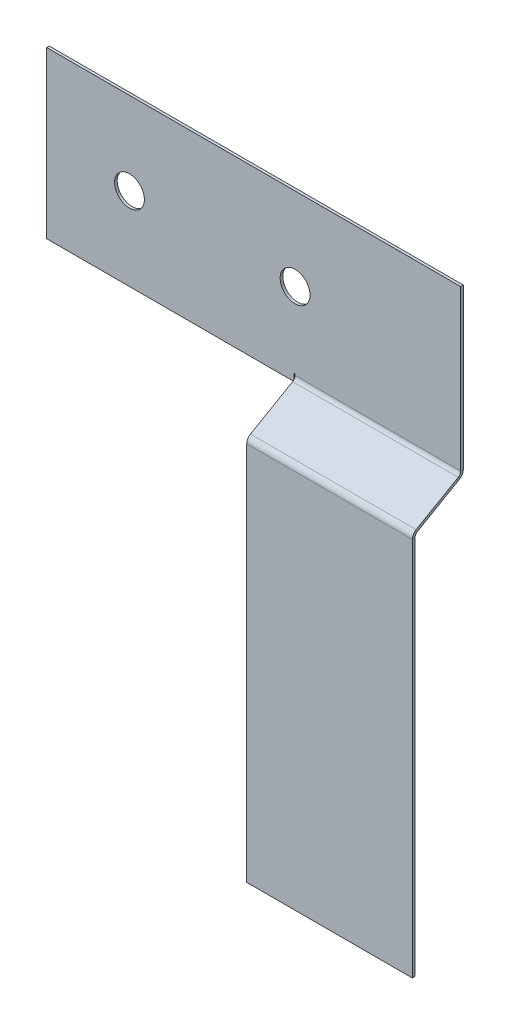
ISO-10303-21;
HEADER;
FILE_DESCRIPTION(('STEP AP214'),'2;1');
FILE_NAME('part.step','',(''),(''),'','','');
FILE_SCHEMA(('AUTOMOTIVE_DESIGN { 1 0 10303 214 1 1 1 1 }'));
ENDSEC;
DATA;
#1=APPLICATION_CONTEXT('core data for automotive mechanical design processes');
#2=APPLICATION_PROTOCOL_DEFINITION('international standard','automotive_design',2000,#1);
#3=PRODUCT_CONTEXT('',#1,'mechanical');
#4=PRODUCT('Part','Part','',(#3));
#5=PRODUCT_RELATED_PRODUCT_CATEGORY('part','',(#4));
#6=PRODUCT_DEFINITION_FORMATION('','',#4);
#7=PRODUCT_DEFINITION_CONTEXT('part definition',#1,'design');
#8=PRODUCT_DEFINITION('design','',#6,#7);
#9=PRODUCT_DEFINITION_SHAPE('','',#8);
#10=(LENGTH_UNIT() NAMED_UNIT(*) SI_UNIT(.MILLI.,.METRE.));
#11=(NAMED_UNIT(*) PLANE_ANGLE_UNIT() SI_UNIT($,.RADIAN.));
#12=(NAMED_UNIT(*) SI_UNIT($,.STERADIAN.) SOLID_ANGLE_UNIT());
#13=UNCERTAINTY_MEASURE_WITH_UNIT(LENGTH_MEASURE(1.E-05),#10,'distance_accuracy_value','');
#14=(GEOMETRIC_REPRESENTATION_CONTEXT(3) GLOBAL_UNCERTAINTY_ASSIGNED_CONTEXT((#13)) GLOBAL_UNIT_ASSIGNED_CONTEXT((#10,
#11,#12)) REPRESENTATION_CONTEXT('',''));
#15=CARTESIAN_POINT('',(0.,0.,0.));
#16=DIRECTION('',(0.,0.,1.));
#17=DIRECTION('',(1.,0.,0.));
#18=AXIS2_PLACEMENT_3D('',#15,#16,#17);
#19=CARTESIAN_POINT('',(62.5,0.,-0.4));
#20=DIRECTION('',(1.,0.,0.));
#21=DIRECTION('',(0.,0.,-1.));
#22=AXIS2_PLACEMENT_3D('',#19,#20,#21);
#23=PLANE('',#22);
#24=DIRECTION('',(0.,1.,0.));
#25=VECTOR('',#24,1.);
#26=CARTESIAN_POINT('',(62.5,0.,0.));
#27=LINE('',#26,#25);
#28=CARTESIAN_POINT('',(62.5,0.88715642363678,0.));
#29=VERTEX_POINT('',#28);
#30=CARTESIAN_POINT('',(62.5,25.,0.));
#31=VERTEX_POINT('',#30);
#32=EDGE_CURVE('E353',#29,#31,#27,.T.);
#33=ORIENTED_EDGE('',*,*,#32,.F.);
#34=DIRECTION('',(0.,0.,-1.));
#35=VECTOR('',#34,1.);
#36=CARTESIAN_POINT('',(62.5,0.88715642363678,0.));
#37=LINE('',#36,#35);
#38=CARTESIAN_POINT('',(62.5,0.88715642363678,-0.400000000000014));
#39=VERTEX_POINT('',#38);
#40=EDGE_CURVE('E287',#29,#39,#37,.T.);
#41=ORIENTED_EDGE('',*,*,#40,.T.);
#42=DIRECTION('',(0.,1.,0.));
#43=VECTOR('',#42,1.);
#44=CARTESIAN_POINT('',(62.5,0.,-0.4));
#45=LINE('',#44,#43);
#46=CARTESIAN_POINT('',(62.5,25.,-0.4));
#47=VERTEX_POINT('',#46);
#48=EDGE_CURVE('E344',#39,#47,#45,.T.);
#49=ORIENTED_EDGE('',*,*,#48,.T.);
#50=DIRECTION('',(0.,0.,1.));
#51=VECTOR('',#50,1.);
#52=CARTESIAN_POINT('',(62.5,25.,-0.4));
#53=LINE('',#52,#51);
#54=EDGE_CURVE('E86',#47,#31,#53,.T.);
#55=ORIENTED_EDGE('',*,*,#54,.T.);
#56=EDGE_LOOP('',(#33,#41,#49,#55));
#57=FACE_BOUND('',#56,.T.);
#58=ADVANCED_FACE('F77',(#57),#23,.T.);
#59=CARTESIAN_POINT('',(0.,0.,-0.4));
#60=DIRECTION('',(0.,-1.,0.));
#61=DIRECTION('',(0.,0.,-1.));
#62=AXIS2_PLACEMENT_3D('',#59,#60,#61);
#63=PLANE('',#62);
#64=DIRECTION('',(1.,0.,0.));
#65=VECTOR('',#64,1.);
#66=CARTESIAN_POINT('',(0.,0.,-0.4));
#67=LINE('',#66,#65);
#68=CARTESIAN_POINT('',(0.,0.,-0.4));
#69=VERTEX_POINT('',#68);
#70=CARTESIAN_POINT('',(37.3,0.,-0.4));
#71=VERTEX_POINT('',#70);
#72=EDGE_CURVE('E340',#69,#71,#67,.T.);
#73=ORIENTED_EDGE('',*,*,#72,.T.);
#74=DIRECTION('',(0.,0.,-1.));
#75=VECTOR('',#74,1.);
#76=CARTESIAN_POINT('',(37.3,0.,0.));
#77=LINE('',#76,#75);
#78=CARTESIAN_POINT('',(37.3,0.,0.));
#79=VERTEX_POINT('',#78);
#80=EDGE_CURVE('E313',#79,#71,#77,.T.);
#81=ORIENTED_EDGE('',*,*,#80,.F.);
#82=DIRECTION('',(1.,0.,0.));
#83=VECTOR('',#82,1.);
#84=CARTESIAN_POINT('',(0.,0.,0.));
#85=LINE('',#84,#83);
#86=CARTESIAN_POINT('',(0.,0.,0.));
#87=VERTEX_POINT('',#86);
#88=EDGE_CURVE('E351',#87,#79,#85,.T.);
#89=ORIENTED_EDGE('',*,*,#88,.F.);
#90=DIRECTION('',(0.,0.,1.));
#91=VECTOR('',#90,1.);
#92=CARTESIAN_POINT('',(0.,0.,-0.4));
#93=LINE('',#92,#91);
#94=EDGE_CURVE('E81',#69,#87,#93,.T.);
#95=ORIENTED_EDGE('',*,*,#94,.F.);
#96=EDGE_LOOP('',(#73,#81,#89,#95));
#97=FACE_BOUND('',#96,.T.);
#98=ADVANCED_FACE('F368',(#97),#63,.T.);
#99=CARTESIAN_POINT('',(0.,0.,-0.4));
#100=DIRECTION('',(0.,0.,-1.));
#101=DIRECTION('',(-1.,0.,0.));
#102=AXIS2_PLACEMENT_3D('',#99,#100,#101);
#103=PLANE('',#102);
#104=CARTESIAN_POINT('',(37.5,12.5,-0.4));
#105=DIRECTION('',(0.,0.,1.));
#106=DIRECTION('',(1.,0.,0.));
#107=AXIS2_PLACEMENT_3D('',#104,#105,#106);
#108=CIRCLE('',#107,2.25);
#109=CARTESIAN_POINT('',(39.75,12.5,-0.4));
#110=VERTEX_POINT('',#109);
#111=EDGE_CURVE('E325',#110,#110,#108,.T.);
#112=ORIENTED_EDGE('',*,*,#111,.T.);
#113=EDGE_LOOP('',(#112));
#114=FACE_BOUND('',#113,.T.);
#115=CARTESIAN_POINT('',(12.5,12.5,-0.4));
#116=DIRECTION('',(0.,0.,1.));
#117=DIRECTION('',(1.,0.,0.));
#118=AXIS2_PLACEMENT_3D('',#115,#116,#117);
#119=CIRCLE('',#118,2.25);
#120=CARTESIAN_POINT('',(14.75,12.5,-0.4));
#121=VERTEX_POINT('',#120);
#122=EDGE_CURVE('E331',#121,#121,#119,.T.);
#123=ORIENTED_EDGE('',*,*,#122,.T.);
#124=EDGE_LOOP('',(#123));
#125=FACE_BOUND('',#124,.T.);
#126=ORIENTED_EDGE('',*,*,#48,.F.);
#127=DIRECTION('',(1.,0.,0.));
#128=VECTOR('',#127,1.);
#129=CARTESIAN_POINT('',(62.5,0.88715642363678,-0.400000000000014));
#130=LINE('',#129,#128);
#131=CARTESIAN_POINT('',(37.5,0.88715642363678,-0.4));
#132=VERTEX_POINT('',#131);
#133=EDGE_CURVE('E283',#39,#132,#130,.F.);
#134=ORIENTED_EDGE('',*,*,#133,.T.);
#135=DIRECTION('',(0.,1.,0.));
#136=VECTOR('',#135,1.);
#137=CARTESIAN_POINT('',(37.5,0.,-0.4));
#138=LINE('',#137,#136);
#139=CARTESIAN_POINT('',(37.5,1.08715642363678,-0.4));
#140=VERTEX_POINT('',#139);
#141=EDGE_CURVE('E102',#132,#140,#138,.T.);
#142=ORIENTED_EDGE('',*,*,#141,.T.);
#143=DIRECTION('',(-1.,0.,0.));
#144=VECTOR('',#143,1.);
#145=CARTESIAN_POINT('',(0.,1.08715642363678,-0.4));
#146=LINE('',#145,#144);
#147=CARTESIAN_POINT('',(37.3,1.08715642363678,-0.4));
#148=VERTEX_POINT('',#147);
#149=EDGE_CURVE('E321',#140,#148,#146,.T.);
#150=ORIENTED_EDGE('',*,*,#149,.T.);
#151=DIRECTION('',(0.,-1.,0.));
#152=VECTOR('',#151,1.);
#153=CARTESIAN_POINT('',(37.3,0.,-0.4));
#154=LINE('',#153,#152);
#155=EDGE_CURVE('E305',#148,#71,#154,.T.);
#156=ORIENTED_EDGE('',*,*,#155,.T.);
#157=ORIENTED_EDGE('',*,*,#72,.F.);
#158=DIRECTION('',(0.,-1.,0.));
#159=VECTOR('',#158,1.);
#160=CARTESIAN_POINT('',(0.,0.,-0.4));
#161=LINE('',#160,#159);
#162=CARTESIAN_POINT('',(0.,25.,-0.4));
#163=VERTEX_POINT('',#162);
#164=EDGE_CURVE('E337',#163,#69,#161,.T.);
#165=ORIENTED_EDGE('',*,*,#164,.F.);
#166=DIRECTION('',(-1.,0.,0.));
#167=VECTOR('',#166,1.);
#168=CARTESIAN_POINT('',(0.,25.,-0.4));
#169=LINE('',#168,#167);
#170=EDGE_CURVE('E346',#47,#163,#169,.T.);
#171=ORIENTED_EDGE('',*,*,#170,.F.);
#172=EDGE_LOOP('',(#126,#134,#142,#150,#156,#157,#165,#171));
#173=FACE_BOUND('',#172,.T.);
#174=ADVANCED_FACE('F376',(#114,#125,#173),#103,.T.);
#175=CARTESIAN_POINT('',(0.,0.,0.));
#176=DIRECTION('',(0.,0.,-1.));
#177=DIRECTION('',(-1.,0.,0.));
#178=AXIS2_PLACEMENT_3D('',#175,#176,#177);
#179=PLANE('',#178);
#180=CARTESIAN_POINT('',(12.5,12.5,0.));
#181=DIRECTION('',(0.,0.,1.));
#182=DIRECTION('',(1.,0.,0.));
#183=AXIS2_PLACEMENT_3D('',#180,#181,#182);
#184=CIRCLE('',#183,2.25);
#185=CARTESIAN_POINT('',(14.75,12.5,0.));
#186=VERTEX_POINT('',#185);
#187=EDGE_CURVE('E328',#186,#186,#184,.T.);
#188=ORIENTED_EDGE('',*,*,#187,.F.);
#189=EDGE_LOOP('',(#188));
#190=FACE_BOUND('',#189,.T.);
#191=CARTESIAN_POINT('',(37.5,12.5,0.));
#192=DIRECTION('',(0.,0.,1.));
#193=DIRECTION('',(1.,0.,0.));
#194=AXIS2_PLACEMENT_3D('',#191,#192,#193);
#195=CIRCLE('',#194,2.25);
#196=CARTESIAN_POINT('',(39.75,12.5,0.));
#197=VERTEX_POINT('',#196);
#198=EDGE_CURVE('E324',#197,#197,#195,.T.);
#199=ORIENTED_EDGE('',*,*,#198,.F.);
#200=EDGE_LOOP('',(#199));
#201=FACE_BOUND('',#200,.T.);
#202=DIRECTION('',(1.,0.,0.));
#203=VECTOR('',#202,1.);
#204=CARTESIAN_POINT('',(62.5,0.88715642363678,0.));
#205=LINE('',#204,#203);
#206=CARTESIAN_POINT('',(37.5,0.88715642363678,0.));
#207=VERTEX_POINT('',#206);
#208=EDGE_CURVE('E293',#29,#207,#205,.F.);
#209=ORIENTED_EDGE('',*,*,#208,.F.);
#210=ORIENTED_EDGE('',*,*,#32,.T.);
#211=DIRECTION('',(-1.,0.,0.));
#212=VECTOR('',#211,1.);
#213=CARTESIAN_POINT('',(0.,25.,0.));
#214=LINE('',#213,#212);
#215=CARTESIAN_POINT('',(0.,25.,0.));
#216=VERTEX_POINT('',#215);
#217=EDGE_CURVE('E341',#31,#216,#214,.T.);
#218=ORIENTED_EDGE('',*,*,#217,.T.);
#219=DIRECTION('',(0.,-1.,0.));
#220=VECTOR('',#219,1.);
#221=CARTESIAN_POINT('',(0.,0.,0.));
#222=LINE('',#221,#220);
#223=EDGE_CURVE('E334',#216,#87,#222,.T.);
#224=ORIENTED_EDGE('',*,*,#223,.T.);
#225=ORIENTED_EDGE('',*,*,#88,.T.);
#226=DIRECTION('',(0.,-1.,0.));
#227=VECTOR('',#226,1.);
#228=CARTESIAN_POINT('',(37.3,1.08715642363678,0.));
#229=LINE('',#228,#227);
#230=CARTESIAN_POINT('',(37.3,1.08715642363678,0.));
#231=VERTEX_POINT('',#230);
#232=EDGE_CURVE('E310',#231,#79,#229,.T.);
#233=ORIENTED_EDGE('',*,*,#232,.F.);
#234=DIRECTION('',(-1.,0.,0.));
#235=VECTOR('',#234,1.);
#236=CARTESIAN_POINT('',(37.5,1.08715642363678,0.));
#237=LINE('',#236,#235);
#238=CARTESIAN_POINT('',(37.5,1.08715642363678,0.));
#239=VERTEX_POINT('',#238);
#240=EDGE_CURVE('E306',#239,#231,#237,.T.);
#241=ORIENTED_EDGE('',*,*,#240,.F.);
#242=DIRECTION('',(0.,1.,0.));
#243=VECTOR('',#242,1.);
#244=CARTESIAN_POINT('',(37.5,0.88715642363678,0.));
#245=LINE('',#244,#243);
#246=EDGE_CURVE('E302',#207,#239,#245,.T.);
#247=ORIENTED_EDGE('',*,*,#246,.F.);
#248=EDGE_LOOP('',(#209,#210,#218,#224,#225,#233,#241,#247));
#249=FACE_BOUND('',#248,.T.);
#250=ADVANCED_FACE('F371',(#190,#201,#249),#179,.F.);
#251=CARTESIAN_POINT('',(0.,0.,-0.4));
#252=DIRECTION('',(-1.,0.,0.));
#253=DIRECTION('',(0.,0.,1.));
#254=AXIS2_PLACEMENT_3D('',#251,#252,#253);
#255=PLANE('',#254);
#256=ORIENTED_EDGE('',*,*,#223,.F.);
#257=DIRECTION('',(0.,0.,1.));
#258=VECTOR('',#257,1.);
#259=CARTESIAN_POINT('',(0.,25.,-0.4));
#260=LINE('',#259,#258);
#261=EDGE_CURVE('E13',#163,#216,#260,.T.);
#262=ORIENTED_EDGE('',*,*,#261,.F.);
#263=ORIENTED_EDGE('',*,*,#164,.T.);
#264=ORIENTED_EDGE('',*,*,#94,.T.);
#265=EDGE_LOOP('',(#256,#262,#263,#264));
#266=FACE_BOUND('',#265,.T.);
#267=ADVANCED_FACE('F79',(#266),#255,.T.);
#268=CARTESIAN_POINT('',(0.,25.,-0.4));
#269=DIRECTION('',(0.,1.,0.));
#270=DIRECTION('',(0.,0.,1.));
#271=AXIS2_PLACEMENT_3D('',#268,#269,#270);
#272=PLANE('',#271);
#273=ORIENTED_EDGE('',*,*,#217,.F.);
#274=ORIENTED_EDGE('',*,*,#54,.F.);
#275=ORIENTED_EDGE('',*,*,#170,.T.);
#276=ORIENTED_EDGE('',*,*,#261,.T.);
#277=EDGE_LOOP('',(#273,#274,#275,#276));
#278=FACE_BOUND('',#277,.T.);
#279=ADVANCED_FACE('F373',(#278),#272,.T.);
#280=CARTESIAN_POINT('',(12.5,12.5,-0.4));
#281=DIRECTION('',(0.,0.,1.));
#282=DIRECTION('',(1.,0.,0.));
#283=AXIS2_PLACEMENT_3D('',#280,#281,#282);
#284=CYLINDRICAL_SURFACE('',#283,2.25);
#285=ORIENTED_EDGE('',*,*,#122,.F.);
#286=EDGE_LOOP('',(#285));
#287=FACE_BOUND('',#286,.T.);
#288=ORIENTED_EDGE('',*,*,#187,.T.);
#289=EDGE_LOOP('',(#288));
#290=FACE_BOUND('',#289,.T.);
#291=ADVANCED_FACE('F405',(#287,#290),#284,.F.);
#292=CARTESIAN_POINT('',(37.5,12.5,-0.4));
#293=DIRECTION('',(0.,0.,1.));
#294=DIRECTION('',(1.,0.,0.));
#295=AXIS2_PLACEMENT_3D('',#292,#293,#294);
#296=CYLINDRICAL_SURFACE('',#295,2.25);
#297=ORIENTED_EDGE('',*,*,#111,.F.);
#298=EDGE_LOOP('',(#297));
#299=FACE_BOUND('',#298,.T.);
#300=ORIENTED_EDGE('',*,*,#198,.T.);
#301=EDGE_LOOP('',(#300));
#302=FACE_BOUND('',#301,.T.);
#303=ADVANCED_FACE('F414',(#299,#302),#296,.F.);
#304=CARTESIAN_POINT('',(37.5,0.88715642363678,0.));
#305=DIRECTION('',(-1.,0.,0.));
#306=DIRECTION('',(0.,0.,1.));
#307=AXIS2_PLACEMENT_3D('',#304,#305,#306);
#308=PLANE('',#307);
#309=ORIENTED_EDGE('',*,*,#141,.F.);
#310=DIRECTION('',(0.,0.,-1.));
#311=VECTOR('',#310,1.);
#312=CARTESIAN_POINT('',(37.5,0.88715642363678,0.));
#313=LINE('',#312,#311);
#314=EDGE_CURVE('E297',#207,#132,#313,.T.);
#315=ORIENTED_EDGE('',*,*,#314,.F.);
#316=ORIENTED_EDGE('',*,*,#246,.T.);
#317=DIRECTION('',(0.,0.,-1.));
#318=VECTOR('',#317,1.);
#319=CARTESIAN_POINT('',(37.5,1.08715642363678,0.));
#320=LINE('',#319,#318);
#321=EDGE_CURVE('E309',#239,#140,#320,.T.);
#322=ORIENTED_EDGE('',*,*,#321,.T.);
#323=EDGE_LOOP('',(#309,#315,#316,#322));
#324=FACE_BOUND('',#323,.T.);
#325=ADVANCED_FACE('F387',(#324),#308,.T.);
#326=CARTESIAN_POINT('',(37.5,1.08715642363678,0.));
#327=DIRECTION('',(0.,-1.,0.));
#328=DIRECTION('',(0.,0.,-1.));
#329=AXIS2_PLACEMENT_3D('',#326,#327,#328);
#330=PLANE('',#329);
#331=ORIENTED_EDGE('',*,*,#149,.F.);
#332=ORIENTED_EDGE('',*,*,#321,.F.);
#333=ORIENTED_EDGE('',*,*,#240,.T.);
#334=DIRECTION('',(0.,0.,-1.));
#335=VECTOR('',#334,1.);
#336=CARTESIAN_POINT('',(37.3,1.08715642363678,0.));
#337=LINE('',#336,#335);
#338=EDGE_CURVE('E299',#231,#148,#337,.T.);
#339=ORIENTED_EDGE('',*,*,#338,.T.);
#340=EDGE_LOOP('',(#331,#332,#333,#339));
#341=FACE_BOUND('',#340,.T.);
#342=ADVANCED_FACE('F385',(#341),#330,.T.);
#343=CARTESIAN_POINT('',(37.3,1.08715642363678,0.));
#344=DIRECTION('',(1.,0.,0.));
#345=DIRECTION('',(0.,0.,-1.));
#346=AXIS2_PLACEMENT_3D('',#343,#344,#345);
#347=PLANE('',#346);
#348=ORIENTED_EDGE('',*,*,#155,.F.);
#349=ORIENTED_EDGE('',*,*,#338,.F.);
#350=ORIENTED_EDGE('',*,*,#232,.T.);
#351=ORIENTED_EDGE('',*,*,#80,.T.);
#352=EDGE_LOOP('',(#348,#349,#350,#351));
#353=FACE_BOUND('',#352,.T.);
#354=ADVANCED_FACE('F379',(#353),#347,.T.);
#355=CARTESIAN_POINT('',(37.5,0.88715642363678,0.736599999999995));
#356=DIRECTION('',(-1.,0.,0.));
#357=DIRECTION('',(0.,0.,1.));
#358=AXIS2_PLACEMENT_3D('',#355,#356,#357);
#359=PLANE('',#358);
#360=DIRECTION('',(0.,0.866025403784436,0.500000000000004));
#361=VECTOR('',#360,1.);
#362=CARTESIAN_POINT('',(37.5,-0.0971680503046093,0.16829999999999));
#363=LINE('',#362,#361);
#364=CARTESIAN_POINT('',(37.5,0.249242111209163,0.368299999999991));
#365=VERTEX_POINT('',#364);
#366=CARTESIAN_POINT('',(37.5,-0.0971680503046115,0.168299999999989));
#367=VERTEX_POINT('',#366);
#368=EDGE_CURVE('E249',#365,#367,#363,.F.);
#369=ORIENTED_EDGE('',*,*,#368,.F.);
#370=CARTESIAN_POINT('',(37.5,0.88715642363678,0.736599999999995));
#371=DIRECTION('',(1.,0.,0.));
#372=DIRECTION('',(0.,0.,-1.));
#373=AXIS2_PLACEMENT_3D('',#370,#371,#372);
#374=CIRCLE('',#373,0.736600000000002);
#375=EDGE_CURVE('E290',#207,#365,#374,.F.);
#376=ORIENTED_EDGE('',*,*,#375,.F.);
#377=ORIENTED_EDGE('',*,*,#314,.T.);
#378=CARTESIAN_POINT('',(37.5,0.88715642363678,0.736599999999995));
#379=DIRECTION('',(1.,0.,0.));
#380=DIRECTION('',(0.,0.,-1.));
#381=AXIS2_PLACEMENT_3D('',#378,#379,#380);
#382=CIRCLE('',#381,1.1366);
#383=EDGE_CURVE('E94',#132,#367,#382,.F.);
#384=ORIENTED_EDGE('',*,*,#383,.T.);
#385=EDGE_LOOP('',(#369,#376,#377,#384));
#386=FACE_BOUND('',#385,.T.);
#387=ADVANCED_FACE('F390',(#386),#359,.T.);
#388=CARTESIAN_POINT('',(62.5,0.88715642363678,0.736599999999988));
#389=DIRECTION('',(-1.,0.,0.));
#390=DIRECTION('',(0.,0.,1.));
#391=AXIS2_PLACEMENT_3D('',#388,#389,#390);
#392=PLANE('',#391);
#393=CARTESIAN_POINT('',(62.5,0.88715642363678,0.736599999999988));
#394=DIRECTION('',(1.,0.,0.));
#395=DIRECTION('',(0.,0.,-1.));
#396=AXIS2_PLACEMENT_3D('',#393,#394,#395);
#397=CIRCLE('',#396,0.736600000000002);
#398=CARTESIAN_POINT('',(62.5,0.249242111209163,0.368299999999984));
#399=VERTEX_POINT('',#398);
#400=EDGE_CURVE('E257',#399,#29,#397,.T.);
#401=ORIENTED_EDGE('',*,*,#400,.F.);
#402=DIRECTION('',(0.,0.866025403784436,0.500000000000004));
#403=VECTOR('',#402,1.);
#404=CARTESIAN_POINT('',(62.5,0.249242111209164,0.368299999999985));
#405=LINE('',#404,#403);
#406=CARTESIAN_POINT('',(62.5,-0.0971680503046063,0.168299999999985));
#407=VERTEX_POINT('',#406);
#408=EDGE_CURVE('E276',#399,#407,#405,.F.);
#409=ORIENTED_EDGE('',*,*,#408,.T.);
#410=CARTESIAN_POINT('',(62.5,0.88715642363678,0.736599999999988));
#411=DIRECTION('',(1.,0.,0.));
#412=DIRECTION('',(0.,0.,-1.));
#413=AXIS2_PLACEMENT_3D('',#410,#411,#412);
#414=CIRCLE('',#413,1.1366);
#415=EDGE_CURVE('E285',#407,#39,#414,.T.);
#416=ORIENTED_EDGE('',*,*,#415,.T.);
#417=ORIENTED_EDGE('',*,*,#40,.F.);
#418=EDGE_LOOP('',(#401,#409,#416,#417));
#419=FACE_BOUND('',#418,.T.);
#420=ADVANCED_FACE('F394',(#419),#392,.F.);
#421=CARTESIAN_POINT('',(62.5,0.88715642363678,0.736599999999988));
#422=DIRECTION('',(1.,0.,0.));
#423=DIRECTION('',(0.,-0.866025403784436,-0.500000000000004));
#424=AXIS2_PLACEMENT_3D('',#421,#422,#423);
#425=CYLINDRICAL_SURFACE('',#424,1.1366);
#426=ORIENTED_EDGE('',*,*,#133,.F.);
#427=ORIENTED_EDGE('',*,*,#415,.F.);
#428=DIRECTION('',(1.,0.,0.));
#429=VECTOR('',#428,1.);
#430=CARTESIAN_POINT('',(37.5,-0.0971680503046091,0.16829999999999));
#431=LINE('',#430,#429);
#432=EDGE_CURVE('E274',#407,#367,#431,.F.);
#433=ORIENTED_EDGE('',*,*,#432,.T.);
#434=ORIENTED_EDGE('',*,*,#383,.F.);
#435=EDGE_LOOP('',(#426,#427,#433,#434));
#436=FACE_BOUND('',#435,.T.);
#437=ADVANCED_FACE('F391',(#436),#425,.T.);
#438=CARTESIAN_POINT('',(62.5,0.88715642363678,0.736599999999988));
#439=DIRECTION('',(1.,0.,0.));
#440=DIRECTION('',(0.,-0.866025403784436,-0.500000000000004));
#441=AXIS2_PLACEMENT_3D('',#438,#439,#440);
#442=CYLINDRICAL_SURFACE('',#441,0.736600000000002);
#443=ORIENTED_EDGE('',*,*,#208,.T.);
#444=ORIENTED_EDGE('',*,*,#375,.T.);
#445=DIRECTION('',(1.,0.,0.));
#446=VECTOR('',#445,1.);
#447=CARTESIAN_POINT('',(37.5,0.249242111209161,0.368299999999989));
#448=LINE('',#447,#446);
#449=EDGE_CURVE('E279',#365,#399,#448,.T.);
#450=ORIENTED_EDGE('',*,*,#449,.T.);
#451=ORIENTED_EDGE('',*,*,#400,.T.);
#452=EDGE_LOOP('',(#443,#444,#450,#451));
#453=FACE_BOUND('',#452,.T.);
#454=ADVANCED_FACE('F429',(#453),#442,.F.);
#455=CARTESIAN_POINT('',(62.5,-3.76905989232418,6.52820323027549));
#456=DIRECTION('',(-1.,0.,0.));
#457=DIRECTION('',(0.,0.,1.));
#458=AXIS2_PLACEMENT_3D('',#455,#456,#457);
#459=PLANE('',#458);
#460=ORIENTED_EDGE('',*,*,#408,.F.);
#461=DIRECTION('',(0.,0.500000000000004,-0.866025403784436));
#462=VECTOR('',#461,1.);
#463=CARTESIAN_POINT('',(62.5,-3.4226497308104,6.72820323027549));
#464=LINE('',#463,#462);
#465=CARTESIAN_POINT('',(62.5,-3.4226497308104,6.72820323027549));
#466=VERTEX_POINT('',#465);
#467=EDGE_CURVE('E272',#399,#466,#464,.F.);
#468=ORIENTED_EDGE('',*,*,#467,.T.);
#469=DIRECTION('',(0.,0.866025403784436,0.500000000000004));
#470=VECTOR('',#469,1.);
#471=CARTESIAN_POINT('',(62.5,-3.76905989232418,6.52820323027549));
#472=LINE('',#471,#470);
#473=CARTESIAN_POINT('',(62.5,-3.76905989232418,6.52820323027549));
#474=VERTEX_POINT('',#473);
#475=EDGE_CURVE('E254',#474,#466,#472,.T.);
#476=ORIENTED_EDGE('',*,*,#475,.F.);
#477=DIRECTION('',(0.,-0.500000000000004,0.866025403784436));
#478=VECTOR('',#477,1.);
#479=CARTESIAN_POINT('',(62.5,0.115470053837928,-0.200000000000002));
#480=LINE('',#479,#478);
#481=EDGE_CURVE('E266',#407,#474,#480,.T.);
#482=ORIENTED_EDGE('',*,*,#481,.F.);
#483=EDGE_LOOP('',(#460,#468,#476,#482));
#484=FACE_BOUND('',#483,.T.);
#485=ADVANCED_FACE('F432',(#484),#459,.F.);
#486=CARTESIAN_POINT('',(37.5,0.115470053837926,-0.2));
#487=DIRECTION('',(1.,0.,0.));
#488=DIRECTION('',(0.,0.,-1.));
#489=AXIS2_PLACEMENT_3D('',#486,#487,#488);
#490=PLANE('',#489);
#491=ORIENTED_EDGE('',*,*,#368,.T.);
#492=DIRECTION('',(0.,0.500000000000004,-0.866025403784436));
#493=VECTOR('',#492,1.);
#494=CARTESIAN_POINT('',(37.5,0.115470053837928,-0.200000000000002));
#495=LINE('',#494,#493);
#496=CARTESIAN_POINT('',(37.5,-3.76905989232418,6.52820323027549));
#497=VERTEX_POINT('',#496);
#498=EDGE_CURVE('E261',#497,#367,#495,.T.);
#499=ORIENTED_EDGE('',*,*,#498,.F.);
#500=DIRECTION('',(0.,0.866025403784436,0.500000000000004));
#501=VECTOR('',#500,1.);
#502=CARTESIAN_POINT('',(37.5,-3.76905989232418,6.52820323027549));
#503=LINE('',#502,#501);
#504=CARTESIAN_POINT('',(37.5,-3.42264973081041,6.72820323027549));
#505=VERTEX_POINT('',#504);
#506=EDGE_CURVE('E258',#497,#505,#503,.T.);
#507=ORIENTED_EDGE('',*,*,#506,.T.);
#508=DIRECTION('',(0.,-0.500000000000004,0.866025403784436));
#509=VECTOR('',#508,1.);
#510=CARTESIAN_POINT('',(37.5,0.461880215351701,0.));
#511=LINE('',#510,#509);
#512=EDGE_CURVE('E268',#505,#365,#511,.F.);
#513=ORIENTED_EDGE('',*,*,#512,.T.);
#514=EDGE_LOOP('',(#491,#499,#507,#513));
#515=FACE_BOUND('',#514,.T.);
#516=ADVANCED_FACE('F438',(#515),#490,.F.);
#517=CARTESIAN_POINT('',(0.,0.115470053837928,-0.200000000000002));
#518=DIRECTION('',(0.,0.866025403784436,0.500000000000004));
#519=DIRECTION('',(0.,-0.500000000000004,0.866025403784436));
#520=AXIS2_PLACEMENT_3D('',#517,#518,#519);
#521=PLANE('',#520);
#522=ORIENTED_EDGE('',*,*,#432,.F.);
#523=ORIENTED_EDGE('',*,*,#481,.T.);
#524=DIRECTION('',(-1.,0.,0.));
#525=VECTOR('',#524,1.);
#526=CARTESIAN_POINT('',(0.,-3.76905989232418,6.52820323027549));
#527=LINE('',#526,#525);
#528=EDGE_CURVE('E264',#474,#497,#527,.T.);
#529=ORIENTED_EDGE('',*,*,#528,.T.);
#530=ORIENTED_EDGE('',*,*,#498,.T.);
#531=EDGE_LOOP('',(#522,#523,#529,#530));
#532=FACE_BOUND('',#531,.T.);
#533=ADVANCED_FACE('F442',(#532),#521,.F.);
#534=CARTESIAN_POINT('',(0.,0.461880215351702,0.));
#535=DIRECTION('',(0.,0.866025403784436,0.500000000000004));
#536=DIRECTION('',(0.,-0.500000000000004,0.866025403784436));
#537=AXIS2_PLACEMENT_3D('',#534,#535,#536);
#538=PLANE('',#537);
#539=ORIENTED_EDGE('',*,*,#467,.F.);
#540=ORIENTED_EDGE('',*,*,#449,.F.);
#541=ORIENTED_EDGE('',*,*,#512,.F.);
#542=DIRECTION('',(1.,0.,0.));
#543=VECTOR('',#542,1.);
#544=CARTESIAN_POINT('',(37.5,-3.4226497308104,6.72820323027549));
#545=LINE('',#544,#543);
#546=EDGE_CURVE('E200',#466,#505,#545,.F.);
#547=ORIENTED_EDGE('',*,*,#546,.F.);
#548=EDGE_LOOP('',(#539,#540,#541,#547));
#549=FACE_BOUND('',#548,.T.);
#550=ADVANCED_FACE('F444',(#549),#538,.T.);
#551=CARTESIAN_POINT('',(62.5,-4.4069742047518,6.15990323027549));
#552=DIRECTION('',(1.,0.,0.));
#553=DIRECTION('',(0.,0.,-1.));
#554=AXIS2_PLACEMENT_3D('',#551,#552,#553);
#555=PLANE('',#554);
#556=DIRECTION('',(0.,0.,1.));
#557=VECTOR('',#556,1.);
#558=CARTESIAN_POINT('',(62.5,-4.40697420475179,7.29650323027548));
#559=LINE('',#558,#557);
#560=CARTESIAN_POINT('',(62.5,-4.4069742047518,6.89650323027549));
#561=VERTEX_POINT('',#560);
#562=CARTESIAN_POINT('',(62.5,-4.4069742047518,7.29650323027549));
#563=VERTEX_POINT('',#562);
#564=EDGE_CURVE('E246',#561,#563,#559,.T.);
#565=ORIENTED_EDGE('',*,*,#564,.F.);
#566=CARTESIAN_POINT('',(62.5,-4.4069742047518,6.15990323027549));
#567=DIRECTION('',(-1.,0.,0.));
#568=DIRECTION('',(0.,0.,1.));
#569=AXIS2_PLACEMENT_3D('',#566,#567,#568);
#570=CIRCLE('',#569,0.7366);
#571=EDGE_CURVE('E204',#474,#561,#570,.F.);
#572=ORIENTED_EDGE('',*,*,#571,.F.);
#573=ORIENTED_EDGE('',*,*,#475,.T.);
#574=CARTESIAN_POINT('',(62.5,-4.4069742047518,6.15990323027549));
#575=DIRECTION('',(-1.,0.,0.));
#576=DIRECTION('',(0.,0.,1.));
#577=AXIS2_PLACEMENT_3D('',#574,#575,#576);
#578=CIRCLE('',#577,1.1366);
#579=EDGE_CURVE('E203',#466,#563,#578,.F.);
#580=ORIENTED_EDGE('',*,*,#579,.T.);
#581=EDGE_LOOP('',(#565,#572,#573,#580));
#582=FACE_BOUND('',#581,.T.);
#583=ADVANCED_FACE('F447',(#582),#555,.T.);
#584=CARTESIAN_POINT('',(37.5,-4.4069742047518,6.15990323027549));
#585=DIRECTION('',(1.,0.,0.));
#586=DIRECTION('',(0.,0.,-1.));
#587=AXIS2_PLACEMENT_3D('',#584,#585,#586);
#588=PLANE('',#587);
#589=CARTESIAN_POINT('',(37.5,-4.4069742047518,6.15990323027549));
#590=DIRECTION('',(-1.,0.,0.));
#591=DIRECTION('',(0.,0.,1.));
#592=AXIS2_PLACEMENT_3D('',#589,#590,#591);
#593=CIRCLE('',#592,0.7366);
#594=CARTESIAN_POINT('',(37.5,-4.4069742047518,6.89650323027549));
#595=VERTEX_POINT('',#594);
#596=EDGE_CURVE('E211',#595,#497,#593,.T.);
#597=ORIENTED_EDGE('',*,*,#596,.F.);
#598=DIRECTION('',(0.,0.,1.));
#599=VECTOR('',#598,1.);
#600=CARTESIAN_POINT('',(37.5,-4.4069742047518,6.89650323027549));
#601=LINE('',#600,#599);
#602=CARTESIAN_POINT('',(37.5,-4.4069742047518,7.29650323027549));
#603=VERTEX_POINT('',#602);
#604=EDGE_CURVE('E208',#595,#603,#601,.T.);
#605=ORIENTED_EDGE('',*,*,#604,.T.);
#606=CARTESIAN_POINT('',(37.5,-4.4069742047518,6.15990323027549));
#607=DIRECTION('',(-1.,0.,0.));
#608=DIRECTION('',(0.,0.,1.));
#609=AXIS2_PLACEMENT_3D('',#606,#607,#608);
#610=CIRCLE('',#609,1.1366);
#611=EDGE_CURVE('E192',#603,#505,#610,.T.);
#612=ORIENTED_EDGE('',*,*,#611,.T.);
#613=ORIENTED_EDGE('',*,*,#506,.F.);
#614=EDGE_LOOP('',(#597,#605,#612,#613));
#615=FACE_BOUND('',#614,.T.);
#616=ADVANCED_FACE('F209',(#615),#588,.F.);
#617=CARTESIAN_POINT('',(37.5,-4.4069742047518,6.15990323027549));
#618=DIRECTION('',(-1.,0.,0.));
#619=DIRECTION('',(0.,0.,1.));
#620=AXIS2_PLACEMENT_3D('',#617,#618,#619);
#621=CYLINDRICAL_SURFACE('',#620,1.1366);
#622=ORIENTED_EDGE('',*,*,#546,.T.);
#623=ORIENTED_EDGE('',*,*,#611,.F.);
#624=DIRECTION('',(-1.,0.,0.));
#625=VECTOR('',#624,1.);
#626=CARTESIAN_POINT('',(0.,-4.4069742047518,7.29650323027549));
#627=LINE('',#626,#625);
#628=EDGE_CURVE('E197',#563,#603,#627,.T.);
#629=ORIENTED_EDGE('',*,*,#628,.F.);
#630=ORIENTED_EDGE('',*,*,#579,.F.);
#631=EDGE_LOOP('',(#622,#623,#629,#630));
#632=FACE_BOUND('',#631,.T.);
#633=ADVANCED_FACE('F194',(#632),#621,.T.);
#634=CARTESIAN_POINT('',(37.5,-4.4069742047518,6.15990323027549));
#635=DIRECTION('',(-1.,0.,0.));
#636=DIRECTION('',(0.,0.,1.));
#637=AXIS2_PLACEMENT_3D('',#634,#635,#636);
#638=CYLINDRICAL_SURFACE('',#637,0.7366);
#639=ORIENTED_EDGE('',*,*,#528,.F.);
#640=ORIENTED_EDGE('',*,*,#571,.T.);
#641=DIRECTION('',(1.,0.,0.));
#642=VECTOR('',#641,1.);
#643=CARTESIAN_POINT('',(62.5,-4.4069742047518,6.89650323027549));
#644=LINE('',#643,#642);
#645=EDGE_CURVE('E216',#561,#595,#644,.F.);
#646=ORIENTED_EDGE('',*,*,#645,.T.);
#647=ORIENTED_EDGE('',*,*,#596,.T.);
#648=EDGE_LOOP('',(#639,#640,#646,#647));
#649=FACE_BOUND('',#648,.T.);
#650=ADVANCED_FACE('F457',(#649),#638,.F.);
#651=CARTESIAN_POINT('',(37.5,-3.98169799646672,7.29650323027549));
#652=DIRECTION('',(-1.,0.,0.));
#653=DIRECTION('',(0.,-1.,0.));
#654=AXIS2_PLACEMENT_3D('',#651,#652,#653);
#655=PLANE('',#654);
#656=DIRECTION('',(0.,1.,0.));
#657=VECTOR('',#656,1.);
#658=CARTESIAN_POINT('',(37.5,-3.98169799646672,7.29650323027549));
#659=LINE('',#658,#657);
#660=CARTESIAN_POINT('',(37.5,-61.7507578887909,7.29650323027548));
#661=VERTEX_POINT('',#660);
#662=EDGE_CURVE('E223',#661,#603,#659,.T.);
#663=ORIENTED_EDGE('',*,*,#662,.T.);
#664=ORIENTED_EDGE('',*,*,#604,.F.);
#665=DIRECTION('',(0.,-1.,0.));
#666=VECTOR('',#665,1.);
#667=CARTESIAN_POINT('',(37.5,-0.212638104142536,6.89650323027549));
#668=LINE('',#667,#666);
#669=CARTESIAN_POINT('',(37.5,-61.7507578887909,6.89650323027548));
#670=VERTEX_POINT('',#669);
#671=EDGE_CURVE('E239',#670,#595,#668,.F.);
#672=ORIENTED_EDGE('',*,*,#671,.F.);
#673=DIRECTION('',(0.,0.,-1.));
#674=VECTOR('',#673,1.);
#675=CARTESIAN_POINT('',(37.5,-61.7507578887909,7.29650323027548));
#676=LINE('',#675,#674);
#677=EDGE_CURVE('E228',#661,#670,#676,.T.);
#678=ORIENTED_EDGE('',*,*,#677,.F.);
#679=EDGE_LOOP('',(#663,#664,#672,#678));
#680=FACE_BOUND('',#679,.T.);
#681=ADVANCED_FACE('F227',(#680),#655,.T.);
#682=CARTESIAN_POINT('',(62.5,-61.7507578887909,7.29650323027548));
#683=DIRECTION('',(1.,0.,0.));
#684=DIRECTION('',(0.,0.,-1.));
#685=AXIS2_PLACEMENT_3D('',#682,#683,#684);
#686=PLANE('',#685);
#687=DIRECTION('',(0.,1.,0.));
#688=VECTOR('',#687,1.);
#689=CARTESIAN_POINT('',(62.5,-0.21263810414254,6.89650323027549));
#690=LINE('',#689,#688);
#691=CARTESIAN_POINT('',(62.5,-61.7507578887909,6.89650323027548));
#692=VERTEX_POINT('',#691);
#693=EDGE_CURVE('E225',#561,#692,#690,.F.);
#694=ORIENTED_EDGE('',*,*,#693,.F.);
#695=ORIENTED_EDGE('',*,*,#564,.T.);
#696=DIRECTION('',(0.,-1.,0.));
#697=VECTOR('',#696,1.);
#698=CARTESIAN_POINT('',(62.5,-61.7507578887909,7.29650323027548));
#699=LINE('',#698,#697);
#700=CARTESIAN_POINT('',(62.5,-61.7507578887909,7.29650323027548));
#701=VERTEX_POINT('',#700);
#702=EDGE_CURVE('E224',#563,#701,#699,.T.);
#703=ORIENTED_EDGE('',*,*,#702,.T.);
#704=DIRECTION('',(0.,0.,-1.));
#705=VECTOR('',#704,1.);
#706=CARTESIAN_POINT('',(62.5,-61.7507578887909,7.29650323027548));
#707=LINE('',#706,#705);
#708=EDGE_CURVE('E230',#701,#692,#707,.T.);
#709=ORIENTED_EDGE('',*,*,#708,.T.);
#710=EDGE_LOOP('',(#694,#695,#703,#709));
#711=FACE_BOUND('',#710,.T.);
#712=ADVANCED_FACE('F463',(#711),#686,.T.);
#713=CARTESIAN_POINT('',(0.,-0.21263810414254,7.29650323027549));
#714=DIRECTION('',(0.,0.,1.));
#715=DIRECTION('',(0.,-1.,0.));
#716=AXIS2_PLACEMENT_3D('',#713,#714,#715);
#717=PLANE('',#716);
#718=ORIENTED_EDGE('',*,*,#702,.F.);
#719=ORIENTED_EDGE('',*,*,#628,.T.);
#720=ORIENTED_EDGE('',*,*,#662,.F.);
#721=DIRECTION('',(-1.,0.,0.));
#722=VECTOR('',#721,1.);
#723=CARTESIAN_POINT('',(37.5,-61.7507578887909,7.29650323027548));
#724=LINE('',#723,#722);
#725=EDGE_CURVE('E231',#701,#661,#724,.T.);
#726=ORIENTED_EDGE('',*,*,#725,.F.);
#727=EDGE_LOOP('',(#718,#719,#720,#726));
#728=FACE_BOUND('',#727,.T.);
#729=ADVANCED_FACE('F221',(#728),#717,.T.);
#730=CARTESIAN_POINT('',(0.,-0.21263810414254,6.89650323027549));
#731=DIRECTION('',(0.,0.,1.));
#732=DIRECTION('',(0.,-1.,0.));
#733=AXIS2_PLACEMENT_3D('',#730,#731,#732);
#734=PLANE('',#733);
#735=ORIENTED_EDGE('',*,*,#645,.F.);
#736=ORIENTED_EDGE('',*,*,#693,.T.);
#737=DIRECTION('',(1.,0.,0.));
#738=VECTOR('',#737,1.);
#739=CARTESIAN_POINT('',(0.,-61.7507578887909,6.89650323027548));
#740=LINE('',#739,#738);
#741=EDGE_CURVE('E241',#692,#670,#740,.F.);
#742=ORIENTED_EDGE('',*,*,#741,.T.);
#743=ORIENTED_EDGE('',*,*,#671,.T.);
#744=EDGE_LOOP('',(#735,#736,#742,#743));
#745=FACE_BOUND('',#744,.T.);
#746=ADVANCED_FACE('F470',(#745),#734,.F.);
#747=CARTESIAN_POINT('',(37.5,-61.7507578887909,7.29650323027548));
#748=DIRECTION('',(0.,-1.,0.));
#749=DIRECTION('',(0.,0.,-1.));
#750=AXIS2_PLACEMENT_3D('',#747,#748,#749);
#751=PLANE('',#750);
#752=ORIENTED_EDGE('',*,*,#741,.F.);
#753=ORIENTED_EDGE('',*,*,#708,.F.);
#754=ORIENTED_EDGE('',*,*,#725,.T.);
#755=ORIENTED_EDGE('',*,*,#677,.T.);
#756=EDGE_LOOP('',(#752,#753,#754,#755));
#757=FACE_BOUND('',#756,.T.);
#758=ADVANCED_FACE('F467',(#757),#751,.T.);
#759=CLOSED_SHELL('',(#58,#98,#174,#250,#267,#279,#291,#303,#325,#342,#354,#387,#420,#437,#454,
#485,#516,#533,#550,#583,#616,#633,#650,#681,#712,#729,#746,#758));
#760=MANIFOLD_SOLID_BREP('B2',#759);
#761=ADVANCED_BREP_SHAPE_REPRESENTATION('',(#18,#760),#14);
#762=SHAPE_DEFINITION_REPRESENTATION(#9,#761);
ENDSEC;
END-ISO-10303-21;
